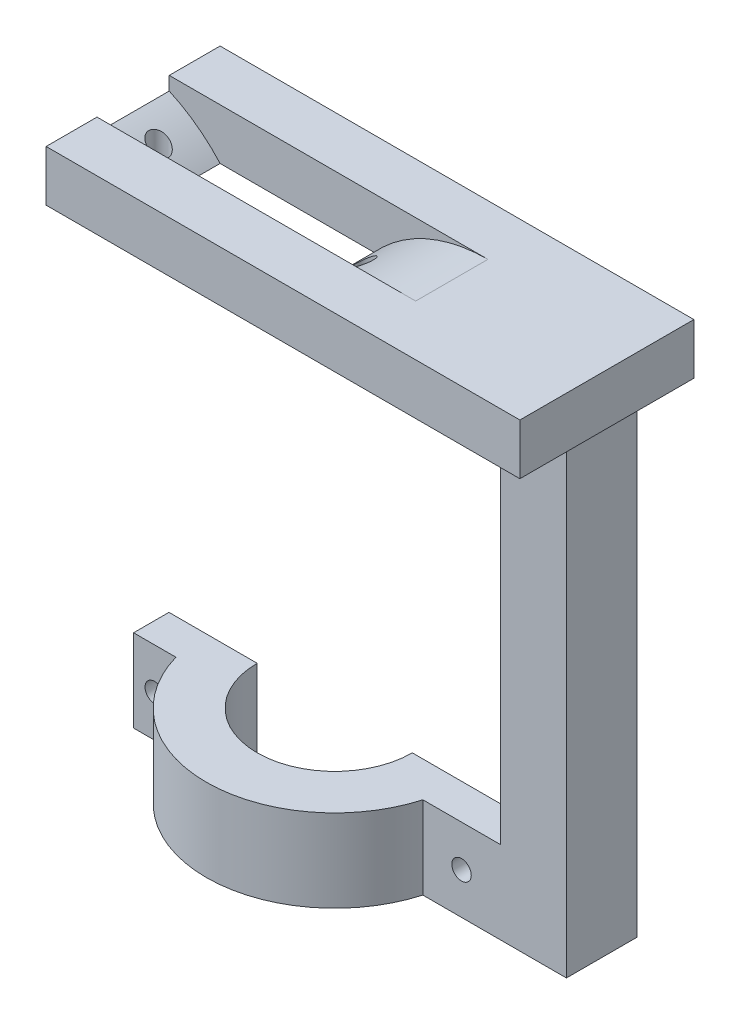
ISO-10303-21;
HEADER;
FILE_DESCRIPTION(('STEP AP214'),'2;1');
FILE_NAME('part.step','',(''),(''),'','','');
FILE_SCHEMA(('AUTOMOTIVE_DESIGN { 1 0 10303 214 1 1 1 1 }'));
ENDSEC;
DATA;
#1=APPLICATION_CONTEXT('core data for automotive mechanical design processes');
#2=APPLICATION_PROTOCOL_DEFINITION('international standard','automotive_design',2000,#1);
#3=PRODUCT_CONTEXT('',#1,'mechanical');
#4=PRODUCT('Part','Part','',(#3));
#5=PRODUCT_RELATED_PRODUCT_CATEGORY('part','',(#4));
#6=PRODUCT_DEFINITION_FORMATION('','',#4);
#7=PRODUCT_DEFINITION_CONTEXT('part definition',#1,'design');
#8=PRODUCT_DEFINITION('design','',#6,#7);
#9=PRODUCT_DEFINITION_SHAPE('','',#8);
#10=(LENGTH_UNIT() NAMED_UNIT(*) SI_UNIT(.MILLI.,.METRE.));
#11=(NAMED_UNIT(*) PLANE_ANGLE_UNIT() SI_UNIT($,.RADIAN.));
#12=(NAMED_UNIT(*) SI_UNIT($,.STERADIAN.) SOLID_ANGLE_UNIT());
#13=UNCERTAINTY_MEASURE_WITH_UNIT(LENGTH_MEASURE(1.E-05),#10,'distance_accuracy_value','');
#14=(GEOMETRIC_REPRESENTATION_CONTEXT(3) GLOBAL_UNCERTAINTY_ASSIGNED_CONTEXT((#13)) GLOBAL_UNIT_ASSIGNED_CONTEXT((#10,
#11,#12)) REPRESENTATION_CONTEXT('',''));
#15=CARTESIAN_POINT('',(0.,0.,0.));
#16=DIRECTION('',(0.,0.,1.));
#17=DIRECTION('',(1.,0.,0.));
#18=AXIS2_PLACEMENT_3D('',#15,#16,#17);
#19=CARTESIAN_POINT('',(25.14,-74.82,6.955));
#20=DIRECTION('',(1.,0.,0.));
#21=DIRECTION('',(0.,0.,-1.));
#22=AXIS2_PLACEMENT_3D('',#19,#20,#21);
#23=PLANE('',#22);
#24=DIRECTION('',(0.,1.,0.));
#25=VECTOR('',#24,1.);
#26=CARTESIAN_POINT('',(25.14,-74.82,6.955));
#27=LINE('',#26,#25);
#28=CARTESIAN_POINT('',(25.14,-58.59,6.955));
#29=VERTEX_POINT('',#28);
#30=CARTESIAN_POINT('',(25.14,15.7457363650206,6.955));
#31=VERTEX_POINT('',#30);
#32=EDGE_CURVE('E370',#29,#31,#27,.T.);
#33=ORIENTED_EDGE('',*,*,#32,.T.);
#34=DIRECTION('',(0.,0.,1.));
#35=VECTOR('',#34,1.);
#36=CARTESIAN_POINT('',(25.14,15.7457363650206,6.955));
#37=LINE('',#36,#35);
#38=CARTESIAN_POINT('',(25.14,15.7457363650206,-6.955));
#39=VERTEX_POINT('',#38);
#40=EDGE_CURVE('E295',#39,#31,#37,.T.);
#41=ORIENTED_EDGE('',*,*,#40,.F.);
#42=DIRECTION('',(0.,1.,0.));
#43=VECTOR('',#42,1.);
#44=CARTESIAN_POINT('',(25.14,-74.82,-6.955));
#45=LINE('',#44,#43);
#46=CARTESIAN_POINT('',(25.14,-74.82,-6.955));
#47=VERTEX_POINT('',#46);
#48=EDGE_CURVE('E365',#47,#39,#45,.T.);
#49=ORIENTED_EDGE('',*,*,#48,.F.);
#50=DIRECTION('',(0.,0.,-1.));
#51=VECTOR('',#50,1.);
#52=CARTESIAN_POINT('',(25.14,-74.82,0.));
#53=LINE('',#52,#51);
#54=CARTESIAN_POINT('',(25.14,-74.82,0.));
#55=VERTEX_POINT('',#54);
#56=EDGE_CURVE('E302',#55,#47,#53,.T.);
#57=ORIENTED_EDGE('',*,*,#56,.F.);
#58=DIRECTION('',(0.,1.,0.));
#59=VECTOR('',#58,1.);
#60=CARTESIAN_POINT('',(25.14,-74.82,0.));
#61=LINE('',#60,#59);
#62=CARTESIAN_POINT('',(25.14,-58.59,0.));
#63=VERTEX_POINT('',#62);
#64=EDGE_CURVE('E311',#55,#63,#61,.T.);
#65=ORIENTED_EDGE('',*,*,#64,.T.);
#66=DIRECTION('',(0.,0.,-1.));
#67=VECTOR('',#66,1.);
#68=CARTESIAN_POINT('',(25.14,-58.59,-6.955));
#69=LINE('',#68,#67);
#70=EDGE_CURVE('E352',#29,#63,#69,.T.);
#71=ORIENTED_EDGE('',*,*,#70,.F.);
#72=EDGE_LOOP('',(#33,#41,#49,#57,#65,#71));
#73=FACE_BOUND('',#72,.T.);
#74=ADVANCED_FACE('F80',(#73),#23,.F.);
#75=CARTESIAN_POINT('',(38.14,5.74573636502059,-6.955));
#76=DIRECTION('',(0.,0.,1.));
#77=DIRECTION('',(0.,-1.,0.));
#78=AXIS2_PLACEMENT_3D('',#75,#76,#77);
#79=PLANE('',#78);
#80=ORIENTED_EDGE('',*,*,#48,.T.);
#81=DIRECTION('',(-1.,0.,0.));
#82=VECTOR('',#81,1.);
#83=CARTESIAN_POINT('',(38.14,15.7457363650206,-6.955));
#84=LINE('',#83,#82);
#85=CARTESIAN_POINT('',(38.14,15.7457363650206,-6.955));
#86=VERTEX_POINT('',#85);
#87=EDGE_CURVE('E292',#86,#39,#84,.T.);
#88=ORIENTED_EDGE('',*,*,#87,.F.);
#89=DIRECTION('',(0.,1.,0.));
#90=VECTOR('',#89,1.);
#91=CARTESIAN_POINT('',(38.14,5.74573636502059,-6.955));
#92=LINE('',#91,#90);
#93=CARTESIAN_POINT('',(38.14,-74.82,-6.955));
#94=VERTEX_POINT('',#93);
#95=EDGE_CURVE('E366',#94,#86,#92,.T.);
#96=ORIENTED_EDGE('',*,*,#95,.F.);
#97=DIRECTION('',(1.,0.,0.));
#98=VECTOR('',#97,1.);
#99=CARTESIAN_POINT('',(38.14,-74.82,-6.955));
#100=LINE('',#99,#98);
#101=EDGE_CURVE('E363',#47,#94,#100,.T.);
#102=ORIENTED_EDGE('',*,*,#101,.F.);
#103=EDGE_LOOP('',(#80,#88,#96,#102));
#104=FACE_BOUND('',#103,.T.);
#105=ADVANCED_FACE('F477',(#104),#79,.F.);
#106=CARTESIAN_POINT('',(38.14,5.74573636502059,6.955));
#107=DIRECTION('',(0.,0.,-1.));
#108=DIRECTION('',(-1.,0.,0.));
#109=AXIS2_PLACEMENT_3D('',#106,#107,#108);
#110=PLANE('',#109);
#111=DIRECTION('',(0.,-1.,0.));
#112=VECTOR('',#111,1.);
#113=CARTESIAN_POINT('',(38.14,5.74573636502059,6.955));
#114=LINE('',#113,#112);
#115=CARTESIAN_POINT('',(38.14,15.7457363650206,6.955));
#116=VERTEX_POINT('',#115);
#117=CARTESIAN_POINT('',(38.14,-74.82,6.955));
#118=VERTEX_POINT('',#117);
#119=EDGE_CURVE('E369',#116,#118,#114,.T.);
#120=ORIENTED_EDGE('',*,*,#119,.F.);
#121=DIRECTION('',(1.,0.,0.));
#122=VECTOR('',#121,1.);
#123=CARTESIAN_POINT('',(38.14,15.7457363650206,6.955));
#124=LINE('',#123,#122);
#125=EDGE_CURVE('E298',#31,#116,#124,.T.);
#126=ORIENTED_EDGE('',*,*,#125,.F.);
#127=ORIENTED_EDGE('',*,*,#32,.F.);
#128=DIRECTION('',(1.,0.,0.));
#129=VECTOR('',#128,1.);
#130=CARTESIAN_POINT('',(9.92000000000001,-58.59,6.955));
#131=LINE('',#130,#129);
#132=CARTESIAN_POINT('',(9.92324607463947,-58.59,6.955));
#133=VERTEX_POINT('',#132);
#134=EDGE_CURVE('E355',#133,#29,#131,.T.);
#135=ORIENTED_EDGE('',*,*,#134,.F.);
#136=DIRECTION('',(0.,1.,0.));
#137=VECTOR('',#136,1.);
#138=CARTESIAN_POINT('',(9.92324607463947,-74.82,6.955));
#139=LINE('',#138,#137);
#140=CARTESIAN_POINT('',(9.92324607463947,-74.82,6.955));
#141=VERTEX_POINT('',#140);
#142=EDGE_CURVE('E347',#133,#141,#139,.F.);
#143=ORIENTED_EDGE('',*,*,#142,.T.);
#144=DIRECTION('',(-1.,0.,0.));
#145=VECTOR('',#144,1.);
#146=CARTESIAN_POINT('',(38.14,-74.82,6.955));
#147=LINE('',#146,#145);
#148=EDGE_CURVE('E360',#118,#141,#147,.T.);
#149=ORIENTED_EDGE('',*,*,#148,.F.);
#150=EDGE_LOOP('',(#120,#126,#127,#135,#143,#149));
#151=FACE_BOUND('',#150,.T.);
#152=CARTESIAN_POINT('',(17.5248952643869,-66.705,6.955));
#153=DIRECTION('',(0.,0.,-1.));
#154=DIRECTION('',(-1.,0.,0.));
#155=AXIS2_PLACEMENT_3D('',#152,#153,#154);
#156=CIRCLE('',#155,1.91);
#157=CARTESIAN_POINT('',(15.6148952643869,-66.705,6.955));
#158=VERTEX_POINT('',#157);
#159=EDGE_CURVE('E351',#158,#158,#156,.T.);
#160=ORIENTED_EDGE('',*,*,#159,.T.);
#161=EDGE_LOOP('',(#160));
#162=FACE_BOUND('',#161,.T.);
#163=ADVANCED_FACE('F481',(#151,#162),#110,.F.);
#164=CARTESIAN_POINT('',(38.14,0.,0.));
#165=DIRECTION('',(1.,0.,0.));
#166=DIRECTION('',(0.,0.,-1.));
#167=AXIS2_PLACEMENT_3D('',#164,#165,#166);
#168=PLANE('',#167);
#169=ORIENTED_EDGE('',*,*,#95,.T.);
#170=DIRECTION('',(0.,0.,-1.));
#171=VECTOR('',#170,1.);
#172=CARTESIAN_POINT('',(38.14,15.7457363650206,6.955));
#173=LINE('',#172,#171);
#174=EDGE_CURVE('E289',#116,#86,#173,.T.);
#175=ORIENTED_EDGE('',*,*,#174,.F.);
#176=ORIENTED_EDGE('',*,*,#119,.T.);
#177=DIRECTION('',(0.,0.,1.));
#178=VECTOR('',#177,1.);
#179=CARTESIAN_POINT('',(38.14,-74.82,6.955));
#180=LINE('',#179,#178);
#181=EDGE_CURVE('E357',#94,#118,#180,.T.);
#182=ORIENTED_EDGE('',*,*,#181,.F.);
#183=EDGE_LOOP('',(#169,#175,#176,#182));
#184=FACE_BOUND('',#183,.T.);
#185=ADVANCED_FACE('F473',(#184),#168,.T.);
#186=CARTESIAN_POINT('',(0.,-74.82,0.));
#187=DIRECTION('',(0.,1.,0.));
#188=DIRECTION('',(0.,0.,1.));
#189=AXIS2_PLACEMENT_3D('',#186,#187,#188);
#190=PLANE('',#189);
#191=DIRECTION('',(0.,0.,-1.));
#192=VECTOR('',#191,1.);
#193=CARTESIAN_POINT('',(-46.9432460746395,-74.82,25.25));
#194=LINE('',#193,#192);
#195=CARTESIAN_POINT('',(-46.9432460746395,-74.82,6.955));
#196=VERTEX_POINT('',#195);
#197=CARTESIAN_POINT('',(-46.9432460746395,-74.82,0.));
#198=VERTEX_POINT('',#197);
#199=EDGE_CURVE('E328',#196,#198,#194,.T.);
#200=ORIENTED_EDGE('',*,*,#199,.T.);
#201=DIRECTION('',(1.,0.,0.));
#202=VECTOR('',#201,1.);
#203=CARTESIAN_POINT('',(25.14,-74.82,0.));
#204=LINE('',#203,#202);
#205=CARTESIAN_POINT('',(-29.6,-74.82,0.));
#206=VERTEX_POINT('',#205);
#207=EDGE_CURVE('E309',#198,#206,#204,.T.);
#208=ORIENTED_EDGE('',*,*,#207,.T.);
#209=CARTESIAN_POINT('',(-14.35,-74.82,0.));
#210=DIRECTION('',(0.,1.,0.));
#211=DIRECTION('',(0.,0.,1.));
#212=AXIS2_PLACEMENT_3D('',#209,#210,#211);
#213=CIRCLE('',#212,15.25);
#214=CARTESIAN_POINT('',(0.900000000000007,-74.82,0.));
#215=VERTEX_POINT('',#214);
#216=EDGE_CURVE('E339',#206,#215,#213,.T.);
#217=ORIENTED_EDGE('',*,*,#216,.T.);
#218=EDGE_CURVE('E305',#215,#55,#204,.T.);
#219=ORIENTED_EDGE('',*,*,#218,.T.);
#220=ORIENTED_EDGE('',*,*,#56,.T.);
#221=ORIENTED_EDGE('',*,*,#101,.T.);
#222=ORIENTED_EDGE('',*,*,#181,.T.);
#223=ORIENTED_EDGE('',*,*,#148,.T.);
#224=CARTESIAN_POINT('',(-14.35,-74.82,0.));
#225=DIRECTION('',(0.,1.,0.));
#226=DIRECTION('',(1.,0.,0.));
#227=AXIS2_PLACEMENT_3D('',#224,#225,#226);
#228=CIRCLE('',#227,25.25);
#229=CARTESIAN_POINT('',(-38.6232460746395,-74.82,6.955));
#230=VERTEX_POINT('',#229);
#231=EDGE_CURVE('E345',#230,#141,#228,.T.);
#232=ORIENTED_EDGE('',*,*,#231,.F.);
#233=DIRECTION('',(1.,0.,0.));
#234=VECTOR('',#233,1.);
#235=CARTESIAN_POINT('',(-50.,-74.82,6.955));
#236=LINE('',#235,#234);
#237=EDGE_CURVE('E335',#196,#230,#236,.T.);
#238=ORIENTED_EDGE('',*,*,#237,.F.);
#239=EDGE_LOOP('',(#200,#208,#217,#219,#220,#221,#222,#223,#232,#238));
#240=FACE_BOUND('',#239,.T.);
#241=ADVANCED_FACE('F469',(#240),#190,.F.);
#242=CARTESIAN_POINT('',(9.92000000000001,-58.59,-6.955));
#243=DIRECTION('',(0.,-1.,0.));
#244=DIRECTION('',(0.,0.,-1.));
#245=AXIS2_PLACEMENT_3D('',#242,#243,#244);
#246=PLANE('',#245);
#247=ORIENTED_EDGE('',*,*,#70,.T.);
#248=DIRECTION('',(1.,0.,0.));
#249=VECTOR('',#248,1.);
#250=CARTESIAN_POINT('',(25.14,-58.59,0.));
#251=LINE('',#250,#249);
#252=CARTESIAN_POINT('',(0.900000000000007,-58.59,0.));
#253=VERTEX_POINT('',#252);
#254=EDGE_CURVE('E301',#253,#63,#251,.T.);
#255=ORIENTED_EDGE('',*,*,#254,.F.);
#256=CARTESIAN_POINT('',(-14.35,-58.59,0.));
#257=DIRECTION('',(0.,1.,0.));
#258=DIRECTION('',(0.,0.,1.));
#259=AXIS2_PLACEMENT_3D('',#256,#257,#258);
#260=CIRCLE('',#259,15.25);
#261=CARTESIAN_POINT('',(-29.6,-58.59,0.));
#262=VERTEX_POINT('',#261);
#263=EDGE_CURVE('E337',#262,#253,#260,.T.);
#264=ORIENTED_EDGE('',*,*,#263,.F.);
#265=CARTESIAN_POINT('',(-46.9432460746395,-58.59,0.));
#266=VERTEX_POINT('',#265);
#267=EDGE_CURVE('E306',#266,#262,#251,.T.);
#268=ORIENTED_EDGE('',*,*,#267,.F.);
#269=DIRECTION('',(0.,0.,-1.));
#270=VECTOR('',#269,1.);
#271=CARTESIAN_POINT('',(-46.9432460746395,-58.59,25.25));
#272=LINE('',#271,#270);
#273=CARTESIAN_POINT('',(-46.9432460746395,-58.59,6.955));
#274=VERTEX_POINT('',#273);
#275=EDGE_CURVE('E332',#274,#266,#272,.T.);
#276=ORIENTED_EDGE('',*,*,#275,.F.);
#277=DIRECTION('',(1.,0.,0.));
#278=VECTOR('',#277,1.);
#279=CARTESIAN_POINT('',(-50.,-58.59,6.955));
#280=LINE('',#279,#278);
#281=CARTESIAN_POINT('',(-38.6232460746395,-58.59,6.955));
#282=VERTEX_POINT('',#281);
#283=EDGE_CURVE('E331',#274,#282,#280,.T.);
#284=ORIENTED_EDGE('',*,*,#283,.T.);
#285=CARTESIAN_POINT('',(-14.35,-58.59,0.));
#286=DIRECTION('',(0.,1.,0.));
#287=DIRECTION('',(1.,0.,0.));
#288=AXIS2_PLACEMENT_3D('',#285,#286,#287);
#289=CIRCLE('',#288,25.25);
#290=EDGE_CURVE('E342',#282,#133,#289,.T.);
#291=ORIENTED_EDGE('',*,*,#290,.T.);
#292=ORIENTED_EDGE('',*,*,#134,.T.);
#293=EDGE_LOOP('',(#247,#255,#264,#268,#276,#284,#291,#292));
#294=FACE_BOUND('',#293,.T.);
#295=ADVANCED_FACE('F465',(#294),#246,.F.);
#296=CARTESIAN_POINT('',(17.5248952643869,-66.705,8.26499999999999));
#297=DIRECTION('',(0.,0.,-1.));
#298=DIRECTION('',(0.,1.,0.));
#299=AXIS2_PLACEMENT_3D('',#296,#297,#298);
#300=CYLINDRICAL_SURFACE('',#299,1.91);
#301=CARTESIAN_POINT('',(17.5248952643869,-66.705,0.));
#302=DIRECTION('',(0.,0.,1.));
#303=DIRECTION('',(1.,0.,0.));
#304=AXIS2_PLACEMENT_3D('',#301,#302,#303);
#305=CIRCLE('',#304,1.91);
#306=CARTESIAN_POINT('',(19.4348952643869,-66.705,0.));
#307=VERTEX_POINT('',#306);
#308=EDGE_CURVE('E324',#307,#307,#305,.F.);
#309=ORIENTED_EDGE('',*,*,#308,.T.);
#310=EDGE_LOOP('',(#309));
#311=FACE_BOUND('',#310,.T.);
#312=ORIENTED_EDGE('',*,*,#159,.F.);
#313=EDGE_LOOP('',(#312));
#314=FACE_BOUND('',#313,.T.);
#315=ADVANCED_FACE('F461',(#311,#314),#300,.F.);
#316=CARTESIAN_POINT('',(-14.35,-74.82,0.));
#317=DIRECTION('',(0.,1.,0.));
#318=DIRECTION('',(0.,0.,1.));
#319=AXIS2_PLACEMENT_3D('',#316,#317,#318);
#320=CYLINDRICAL_SURFACE('',#319,25.25);
#321=DIRECTION('',(0.,1.,0.));
#322=VECTOR('',#321,1.);
#323=CARTESIAN_POINT('',(-38.6232460746395,-74.82,6.955));
#324=LINE('',#323,#322);
#325=EDGE_CURVE('E372',#230,#282,#324,.T.);
#326=ORIENTED_EDGE('',*,*,#325,.F.);
#327=ORIENTED_EDGE('',*,*,#231,.T.);
#328=ORIENTED_EDGE('',*,*,#142,.F.);
#329=ORIENTED_EDGE('',*,*,#290,.F.);
#330=EDGE_LOOP('',(#326,#327,#328,#329));
#331=FACE_BOUND('',#330,.T.);
#332=ADVANCED_FACE('F457',(#331),#320,.T.);
#333=CARTESIAN_POINT('',(-14.35,-74.82,0.));
#334=DIRECTION('',(0.,1.,0.));
#335=DIRECTION('',(0.,0.,1.));
#336=AXIS2_PLACEMENT_3D('',#333,#334,#335);
#337=CYLINDRICAL_SURFACE('',#336,15.25);
#338=ORIENTED_EDGE('',*,*,#263,.T.);
#339=DIRECTION('',(0.,1.,0.));
#340=VECTOR('',#339,1.);
#341=CARTESIAN_POINT('',(0.900000000000007,-74.82,0.));
#342=LINE('',#341,#340);
#343=EDGE_CURVE('E321',#253,#215,#342,.F.);
#344=ORIENTED_EDGE('',*,*,#343,.T.);
#345=ORIENTED_EDGE('',*,*,#216,.F.);
#346=DIRECTION('',(0.,1.,0.));
#347=VECTOR('',#346,1.);
#348=CARTESIAN_POINT('',(-29.6,-74.82,0.));
#349=LINE('',#348,#347);
#350=EDGE_CURVE('E318',#206,#262,#349,.T.);
#351=ORIENTED_EDGE('',*,*,#350,.T.);
#352=EDGE_LOOP('',(#338,#344,#345,#351));
#353=FACE_BOUND('',#352,.T.);
#354=ADVANCED_FACE('F453',(#353),#337,.F.);
#355=CARTESIAN_POINT('',(-50.,-58.59,6.955));
#356=DIRECTION('',(0.,0.,1.));
#357=DIRECTION('',(1.,0.,0.));
#358=AXIS2_PLACEMENT_3D('',#355,#356,#357);
#359=PLANE('',#358);
#360=CARTESIAN_POINT('',(-42.7865081517211,-66.705,6.955));
#361=DIRECTION('',(0.,0.,1.));
#362=DIRECTION('',(1.,0.,0.));
#363=AXIS2_PLACEMENT_3D('',#360,#361,#362);
#364=CIRCLE('',#363,1.91);
#365=CARTESIAN_POINT('',(-40.8765081517211,-66.705,6.955));
#366=VERTEX_POINT('',#365);
#367=EDGE_CURVE('E327',#366,#366,#364,.T.);
#368=ORIENTED_EDGE('',*,*,#367,.F.);
#369=EDGE_LOOP('',(#368));
#370=FACE_BOUND('',#369,.T.);
#371=DIRECTION('',(0.,1.,0.));
#372=VECTOR('',#371,1.);
#373=CARTESIAN_POINT('',(-46.9432460746395,-58.59,6.955));
#374=LINE('',#373,#372);
#375=EDGE_CURVE('E377',#196,#274,#374,.T.);
#376=ORIENTED_EDGE('',*,*,#375,.F.);
#377=ORIENTED_EDGE('',*,*,#237,.T.);
#378=ORIENTED_EDGE('',*,*,#325,.T.);
#379=ORIENTED_EDGE('',*,*,#283,.F.);
#380=EDGE_LOOP('',(#376,#377,#378,#379));
#381=FACE_BOUND('',#380,.T.);
#382=ADVANCED_FACE('F449',(#370,#381),#359,.T.);
#383=CARTESIAN_POINT('',(-46.9432460746395,-74.82,25.25));
#384=DIRECTION('',(1.,0.,0.));
#385=DIRECTION('',(0.,0.,-1.));
#386=AXIS2_PLACEMENT_3D('',#383,#384,#385);
#387=PLANE('',#386);
#388=ORIENTED_EDGE('',*,*,#275,.T.);
#389=DIRECTION('',(0.,-1.,0.));
#390=VECTOR('',#389,1.);
#391=CARTESIAN_POINT('',(-46.9432460746395,-74.82,0.));
#392=LINE('',#391,#390);
#393=EDGE_CURVE('E315',#266,#198,#392,.T.);
#394=ORIENTED_EDGE('',*,*,#393,.T.);
#395=ORIENTED_EDGE('',*,*,#199,.F.);
#396=ORIENTED_EDGE('',*,*,#375,.T.);
#397=EDGE_LOOP('',(#388,#394,#395,#396));
#398=FACE_BOUND('',#397,.T.);
#399=ADVANCED_FACE('F445',(#398),#387,.F.);
#400=CARTESIAN_POINT('',(-42.7865081517211,-66.705,25.25));
#401=DIRECTION('',(0.,0.,-1.));
#402=DIRECTION('',(-1.,0.,0.));
#403=AXIS2_PLACEMENT_3D('',#400,#401,#402);
#404=CYLINDRICAL_SURFACE('',#403,1.91);
#405=CARTESIAN_POINT('',(-42.7865081517211,-66.705,0.));
#406=DIRECTION('',(0.,0.,1.));
#407=DIRECTION('',(1.,0.,0.));
#408=AXIS2_PLACEMENT_3D('',#405,#406,#407);
#409=CIRCLE('',#408,1.91);
#410=CARTESIAN_POINT('',(-40.8765081517211,-66.705,0.));
#411=VERTEX_POINT('',#410);
#412=EDGE_CURVE('E314',#411,#411,#409,.F.);
#413=ORIENTED_EDGE('',*,*,#412,.T.);
#414=EDGE_LOOP('',(#413));
#415=FACE_BOUND('',#414,.T.);
#416=ORIENTED_EDGE('',*,*,#367,.T.);
#417=EDGE_LOOP('',(#416));
#418=FACE_BOUND('',#417,.T.);
#419=ADVANCED_FACE('F442',(#415,#418),#404,.F.);
#420=CARTESIAN_POINT('',(25.14,-74.82,0.));
#421=DIRECTION('',(0.,0.,1.));
#422=DIRECTION('',(1.,0.,0.));
#423=AXIS2_PLACEMENT_3D('',#420,#421,#422);
#424=PLANE('',#423);
#425=ORIENTED_EDGE('',*,*,#412,.F.);
#426=EDGE_LOOP('',(#425));
#427=FACE_BOUND('',#426,.T.);
#428=ORIENTED_EDGE('',*,*,#207,.F.);
#429=ORIENTED_EDGE('',*,*,#393,.F.);
#430=ORIENTED_EDGE('',*,*,#267,.T.);
#431=ORIENTED_EDGE('',*,*,#350,.F.);
#432=EDGE_LOOP('',(#428,#429,#430,#431));
#433=FACE_BOUND('',#432,.T.);
#434=ADVANCED_FACE('F440',(#427,#433),#424,.F.);
#435=ORIENTED_EDGE('',*,*,#254,.T.);
#436=ORIENTED_EDGE('',*,*,#64,.F.);
#437=ORIENTED_EDGE('',*,*,#218,.F.);
#438=ORIENTED_EDGE('',*,*,#343,.F.);
#439=EDGE_LOOP('',(#435,#436,#437,#438));
#440=FACE_BOUND('',#439,.T.);
#441=ORIENTED_EDGE('',*,*,#308,.F.);
#442=EDGE_LOOP('',(#441));
#443=FACE_BOUND('',#442,.T.);
#444=ADVANCED_FACE('F426',(#440,#443),#424,.F.);
#445=CARTESIAN_POINT('',(0.,15.7457363650206,0.));
#446=DIRECTION('',(0.,-1.,0.));
#447=DIRECTION('',(0.,0.,-1.));
#448=AXIS2_PLACEMENT_3D('',#445,#446,#447);
#449=PLANE('',#448);
#450=CARTESIAN_POINT('',(-48.9900000000017,15.7457363650206,0.));
#451=DIRECTION('',(0.,1.,0.));
#452=DIRECTION('',(0.,0.,1.));
#453=AXIS2_PLACEMENT_3D('',#450,#451,#452);
#454=CIRCLE('',#453,1.91000000000001);
#455=CARTESIAN_POINT('',(-48.9900000000017,15.7457363650206,1.91000000000001));
#456=VERTEX_POINT('',#455);
#457=EDGE_CURVE('E402',#456,#456,#454,.T.);
#458=ORIENTED_EDGE('',*,*,#457,.T.);
#459=EDGE_LOOP('',(#458));
#460=FACE_BOUND('',#459,.T.);
#461=CARTESIAN_POINT('',(-8.71000000000389,15.7457363650206,0.));
#462=DIRECTION('',(0.,1.,0.));
#463=DIRECTION('',(0.,0.,1.));
#464=AXIS2_PLACEMENT_3D('',#461,#462,#463);
#465=CIRCLE('',#464,1.91);
#466=CARTESIAN_POINT('',(-8.71000000000389,15.7457363650206,1.91));
#467=VERTEX_POINT('',#466);
#468=EDGE_CURVE('E401',#467,#467,#465,.T.);
#469=ORIENTED_EDGE('',*,*,#468,.T.);
#470=EDGE_LOOP('',(#469));
#471=FACE_BOUND('',#470,.T.);
#472=DIRECTION('',(0.,0.,-1.));
#473=VECTOR('',#472,1.);
#474=CARTESIAN_POINT('',(-43.99,15.7457363650206,0.));
#475=LINE('',#474,#473);
#476=CARTESIAN_POINT('',(-43.99,15.7457363650206,7.1));
#477=VERTEX_POINT('',#476);
#478=CARTESIAN_POINT('',(-43.99,15.7457363650206,-7.1));
#479=VERTEX_POINT('',#478);
#480=EDGE_CURVE('E229',#477,#479,#475,.T.);
#481=ORIENTED_EDGE('',*,*,#480,.F.);
#482=DIRECTION('',(-1.,0.,0.));
#483=VECTOR('',#482,1.);
#484=CARTESIAN_POINT('',(0.,15.7457363650206,7.1));
#485=LINE('',#484,#483);
#486=CARTESIAN_POINT('',(-13.71,15.7457363650206,7.1));
#487=VERTEX_POINT('',#486);
#488=EDGE_CURVE('E237',#487,#477,#485,.T.);
#489=ORIENTED_EDGE('',*,*,#488,.F.);
#490=DIRECTION('',(0.,0.,1.));
#491=VECTOR('',#490,1.);
#492=CARTESIAN_POINT('',(-13.71,15.7457363650206,0.));
#493=LINE('',#492,#491);
#494=CARTESIAN_POINT('',(-13.71,15.7457363650206,-7.1));
#495=VERTEX_POINT('',#494);
#496=EDGE_CURVE('E243',#495,#487,#493,.T.);
#497=ORIENTED_EDGE('',*,*,#496,.F.);
#498=DIRECTION('',(1.,0.,0.));
#499=VECTOR('',#498,1.);
#500=CARTESIAN_POINT('',(0.,15.7457363650206,-7.1));
#501=LINE('',#500,#499);
#502=EDGE_CURVE('E250',#479,#495,#501,.T.);
#503=ORIENTED_EDGE('',*,*,#502,.F.);
#504=EDGE_LOOP('',(#481,#489,#497,#503));
#505=FACE_BOUND('',#504,.T.);
#506=DIRECTION('',(0.,0.,-1.));
#507=VECTOR('',#506,1.);
#508=CARTESIAN_POINT('',(39.14,15.7457363650206,17.1));
#509=LINE('',#508,#507);
#510=CARTESIAN_POINT('',(39.14,15.7457363650206,17.1));
#511=VERTEX_POINT('',#510);
#512=CARTESIAN_POINT('',(39.14,15.7457363650206,-17.1));
#513=VERTEX_POINT('',#512);
#514=EDGE_CURVE('E268',#511,#513,#509,.T.);
#515=ORIENTED_EDGE('',*,*,#514,.F.);
#516=DIRECTION('',(1.,0.,0.));
#517=VECTOR('',#516,1.);
#518=CARTESIAN_POINT('',(24.14,15.7457363650206,17.1));
#519=LINE('',#518,#517);
#520=CARTESIAN_POINT('',(-53.99,15.7457363650206,17.1));
#521=VERTEX_POINT('',#520);
#522=EDGE_CURVE('E273',#521,#511,#519,.T.);
#523=ORIENTED_EDGE('',*,*,#522,.F.);
#524=DIRECTION('',(0.,0.,1.));
#525=VECTOR('',#524,1.);
#526=CARTESIAN_POINT('',(-53.99,15.7457363650206,-17.1));
#527=LINE('',#526,#525);
#528=CARTESIAN_POINT('',(-53.99,15.7457363650206,-17.1));
#529=VERTEX_POINT('',#528);
#530=EDGE_CURVE('E254',#529,#521,#527,.T.);
#531=ORIENTED_EDGE('',*,*,#530,.F.);
#532=DIRECTION('',(-1.,0.,0.));
#533=VECTOR('',#532,1.);
#534=CARTESIAN_POINT('',(24.14,15.7457363650206,-17.1));
#535=LINE('',#534,#533);
#536=EDGE_CURVE('E281',#513,#529,#535,.T.);
#537=ORIENTED_EDGE('',*,*,#536,.F.);
#538=EDGE_LOOP('',(#515,#523,#531,#537));
#539=FACE_BOUND('',#538,.T.);
#540=ORIENTED_EDGE('',*,*,#40,.T.);
#541=ORIENTED_EDGE('',*,*,#125,.T.);
#542=ORIENTED_EDGE('',*,*,#174,.T.);
#543=ORIENTED_EDGE('',*,*,#87,.T.);
#544=EDGE_LOOP('',(#540,#541,#542,#543));
#545=FACE_BOUND('',#544,.T.);
#546=ADVANCED_FACE('F247',(#460,#471,#505,#539,#545),#449,.T.);
#547=CARTESIAN_POINT('',(39.14,25.7457363650206,17.1));
#548=DIRECTION('',(-1.,0.,0.));
#549=DIRECTION('',(0.,0.,1.));
#550=AXIS2_PLACEMENT_3D('',#547,#548,#549);
#551=PLANE('',#550);
#552=ORIENTED_EDGE('',*,*,#514,.T.);
#553=DIRECTION('',(0.,-1.,0.));
#554=VECTOR('',#553,1.);
#555=CARTESIAN_POINT('',(39.14,25.7457363650206,-17.1));
#556=LINE('',#555,#554);
#557=CARTESIAN_POINT('',(39.14,25.7457363650206,-17.1));
#558=VERTEX_POINT('',#557);
#559=EDGE_CURVE('E286',#558,#513,#556,.T.);
#560=ORIENTED_EDGE('',*,*,#559,.F.);
#561=DIRECTION('',(0.,0.,-1.));
#562=VECTOR('',#561,1.);
#563=CARTESIAN_POINT('',(39.14,25.7457363650206,17.1));
#564=LINE('',#563,#562);
#565=CARTESIAN_POINT('',(39.14,25.7457363650206,17.1));
#566=VERTEX_POINT('',#565);
#567=EDGE_CURVE('E269',#566,#558,#564,.T.);
#568=ORIENTED_EDGE('',*,*,#567,.F.);
#569=DIRECTION('',(0.,-1.,0.));
#570=VECTOR('',#569,1.);
#571=CARTESIAN_POINT('',(39.14,25.7457363650206,17.1));
#572=LINE('',#571,#570);
#573=EDGE_CURVE('E278',#566,#511,#572,.T.);
#574=ORIENTED_EDGE('',*,*,#573,.T.);
#575=EDGE_LOOP('',(#552,#560,#568,#574));
#576=FACE_BOUND('',#575,.T.);
#577=ADVANCED_FACE('F425',(#576),#551,.F.);
#578=CARTESIAN_POINT('',(24.14,25.7457363650206,-17.1));
#579=DIRECTION('',(0.,0.,1.));
#580=DIRECTION('',(1.,0.,0.));
#581=AXIS2_PLACEMENT_3D('',#578,#579,#580);
#582=PLANE('',#581);
#583=ORIENTED_EDGE('',*,*,#536,.T.);
#584=DIRECTION('',(0.,-1.,0.));
#585=VECTOR('',#584,1.);
#586=CARTESIAN_POINT('',(-53.99,25.7457363650206,-17.1));
#587=LINE('',#586,#585);
#588=CARTESIAN_POINT('',(-53.99,25.7457363650206,-17.1));
#589=VERTEX_POINT('',#588);
#590=EDGE_CURVE('E251',#589,#529,#587,.T.);
#591=ORIENTED_EDGE('',*,*,#590,.F.);
#592=DIRECTION('',(-1.,0.,0.));
#593=VECTOR('',#592,1.);
#594=CARTESIAN_POINT('',(24.14,25.7457363650206,-17.1));
#595=LINE('',#594,#593);
#596=EDGE_CURVE('E272',#558,#589,#595,.T.);
#597=ORIENTED_EDGE('',*,*,#596,.F.);
#598=ORIENTED_EDGE('',*,*,#559,.T.);
#599=EDGE_LOOP('',(#583,#591,#597,#598));
#600=FACE_BOUND('',#599,.T.);
#601=ADVANCED_FACE('F430',(#600),#582,.F.);
#602=CARTESIAN_POINT('',(24.14,25.7457363650206,17.1));
#603=DIRECTION('',(0.,0.,-1.));
#604=DIRECTION('',(-1.,0.,0.));
#605=AXIS2_PLACEMENT_3D('',#602,#603,#604);
#606=PLANE('',#605);
#607=ORIENTED_EDGE('',*,*,#522,.T.);
#608=ORIENTED_EDGE('',*,*,#573,.F.);
#609=DIRECTION('',(1.,0.,0.));
#610=VECTOR('',#609,1.);
#611=CARTESIAN_POINT('',(24.14,25.7457363650206,17.1));
#612=LINE('',#611,#610);
#613=CARTESIAN_POINT('',(-53.99,25.7457363650206,17.1));
#614=VERTEX_POINT('',#613);
#615=EDGE_CURVE('E276',#614,#566,#612,.T.);
#616=ORIENTED_EDGE('',*,*,#615,.F.);
#617=DIRECTION('',(0.,1.,0.));
#618=VECTOR('',#617,1.);
#619=CARTESIAN_POINT('',(-53.99,25.7457363650206,17.1));
#620=LINE('',#619,#618);
#621=EDGE_CURVE('E261',#521,#614,#620,.T.);
#622=ORIENTED_EDGE('',*,*,#621,.F.);
#623=EDGE_LOOP('',(#607,#608,#616,#622));
#624=FACE_BOUND('',#623,.T.);
#625=ADVANCED_FACE('F422',(#624),#606,.F.);
#626=CARTESIAN_POINT('',(0.,25.7457363650206,0.));
#627=DIRECTION('',(0.,-1.,0.));
#628=DIRECTION('',(0.,0.,-1.));
#629=AXIS2_PLACEMENT_3D('',#626,#627,#628);
#630=PLANE('',#629);
#631=DIRECTION('',(1.,0.,0.));
#632=VECTOR('',#631,1.);
#633=CARTESIAN_POINT('',(-13.71,25.7457363650206,7.1));
#634=LINE('',#633,#632);
#635=CARTESIAN_POINT('',(-53.99,25.7457363650206,7.1));
#636=VERTEX_POINT('',#635);
#637=CARTESIAN_POINT('',(8.6506797749979,25.7457363650206,7.1));
#638=VERTEX_POINT('',#637);
#639=EDGE_CURVE('E101',#636,#638,#634,.T.);
#640=ORIENTED_EDGE('',*,*,#639,.F.);
#641=DIRECTION('',(0.,0.,-1.));
#642=VECTOR('',#641,1.);
#643=CARTESIAN_POINT('',(-53.99,25.7457363650206,-17.1));
#644=LINE('',#643,#642);
#645=EDGE_CURVE('E265',#614,#636,#644,.T.);
#646=ORIENTED_EDGE('',*,*,#645,.F.);
#647=ORIENTED_EDGE('',*,*,#615,.T.);
#648=ORIENTED_EDGE('',*,*,#567,.T.);
#649=ORIENTED_EDGE('',*,*,#596,.T.);
#650=CARTESIAN_POINT('',(-53.99,25.7457363650206,-7.1));
#651=VERTEX_POINT('',#650);
#652=EDGE_CURVE('E264',#651,#589,#644,.T.);
#653=ORIENTED_EDGE('',*,*,#652,.F.);
#654=DIRECTION('',(-1.,0.,0.));
#655=VECTOR('',#654,1.);
#656=CARTESIAN_POINT('',(-13.71,25.7457363650206,-7.1));
#657=LINE('',#656,#655);
#658=CARTESIAN_POINT('',(8.6506797749979,25.7457363650206,-7.1));
#659=VERTEX_POINT('',#658);
#660=EDGE_CURVE('E244',#659,#651,#657,.T.);
#661=ORIENTED_EDGE('',*,*,#660,.F.);
#662=DIRECTION('',(0.,0.,-1.));
#663=VECTOR('',#662,1.);
#664=CARTESIAN_POINT('',(8.6506797749979,25.7457363650206,0.));
#665=LINE('',#664,#663);
#666=EDGE_CURVE('E379',#659,#638,#665,.F.);
#667=ORIENTED_EDGE('',*,*,#666,.T.);
#668=EDGE_LOOP('',(#640,#646,#647,#648,#649,#653,#661,#667));
#669=FACE_BOUND('',#668,.T.);
#670=ADVANCED_FACE('F418',(#669),#630,.F.);
#671=CARTESIAN_POINT('',(-53.99,0.,0.));
#672=DIRECTION('',(-1.,0.,0.));
#673=DIRECTION('',(0.,0.,1.));
#674=AXIS2_PLACEMENT_3D('',#671,#672,#673);
#675=PLANE('',#674);
#676=ORIENTED_EDGE('',*,*,#645,.T.);
#677=DIRECTION('',(0.,-1.,0.));
#678=VECTOR('',#677,1.);
#679=CARTESIAN_POINT('',(-53.99,-24.5342636349794,7.1));
#680=LINE('',#679,#678);
#681=CARTESIAN_POINT('',(-53.99,23.0809443484978,7.1));
#682=VERTEX_POINT('',#681);
#683=EDGE_CURVE('E234',#636,#682,#680,.T.);
#684=ORIENTED_EDGE('',*,*,#683,.T.);
#685=DIRECTION('',(0.,0.,1.));
#686=VECTOR('',#685,1.);
#687=CARTESIAN_POINT('',(-53.99,23.0809443484978,0.));
#688=LINE('',#687,#686);
#689=CARTESIAN_POINT('',(-53.99,23.0809443484978,-7.1));
#690=VERTEX_POINT('',#689);
#691=EDGE_CURVE('E230',#682,#690,#688,.F.);
#692=ORIENTED_EDGE('',*,*,#691,.T.);
#693=DIRECTION('',(0.,1.,0.));
#694=VECTOR('',#693,1.);
#695=CARTESIAN_POINT('',(-53.99,-24.5342636349794,-7.1));
#696=LINE('',#695,#694);
#697=EDGE_CURVE('E109',#690,#651,#696,.T.);
#698=ORIENTED_EDGE('',*,*,#697,.T.);
#699=ORIENTED_EDGE('',*,*,#652,.T.);
#700=ORIENTED_EDGE('',*,*,#590,.T.);
#701=ORIENTED_EDGE('',*,*,#530,.T.);
#702=ORIENTED_EDGE('',*,*,#621,.T.);
#703=EDGE_LOOP('',(#676,#684,#692,#698,#699,#700,#701,#702));
#704=FACE_BOUND('',#703,.T.);
#705=ADVANCED_FACE('F413',(#704),#675,.T.);
#706=CARTESIAN_POINT('',(-13.71,-24.5342636349794,-7.1));
#707=DIRECTION('',(0.,0.,-1.));
#708=DIRECTION('',(-1.,0.,0.));
#709=AXIS2_PLACEMENT_3D('',#706,#707,#708);
#710=PLANE('',#709);
#711=ORIENTED_EDGE('',*,*,#502,.T.);
#712=CARTESIAN_POINT('',(8.6506797749979,-4.25426363497941,-7.1));
#713=DIRECTION('',(0.,0.,-1.));
#714=DIRECTION('',(-1.,0.,0.));
#715=AXIS2_PLACEMENT_3D('',#712,#713,#714);
#716=CIRCLE('',#715,30.);
#717=EDGE_CURVE('E93',#495,#659,#716,.T.);
#718=ORIENTED_EDGE('',*,*,#717,.T.);
#719=ORIENTED_EDGE('',*,*,#660,.T.);
#720=ORIENTED_EDGE('',*,*,#697,.F.);
#721=CARTESIAN_POINT('',(-66.3506797749979,-4.25426363497941,-7.1));
#722=DIRECTION('',(0.,0.,-1.));
#723=DIRECTION('',(-1.,0.,0.));
#724=AXIS2_PLACEMENT_3D('',#721,#722,#723);
#725=CIRCLE('',#724,30.);
#726=EDGE_CURVE('E233',#690,#479,#725,.T.);
#727=ORIENTED_EDGE('',*,*,#726,.T.);
#728=EDGE_LOOP('',(#711,#718,#719,#720,#727));
#729=FACE_BOUND('',#728,.T.);
#730=ADVANCED_FACE('F410',(#729),#710,.F.);
#731=CARTESIAN_POINT('',(-13.71,-24.5342636349794,7.1));
#732=DIRECTION('',(0.,0.,1.));
#733=DIRECTION('',(1.,0.,0.));
#734=AXIS2_PLACEMENT_3D('',#731,#732,#733);
#735=PLANE('',#734);
#736=ORIENTED_EDGE('',*,*,#488,.T.);
#737=CARTESIAN_POINT('',(-66.3506797749979,-4.25426363497941,7.1));
#738=DIRECTION('',(0.,0.,1.));
#739=DIRECTION('',(1.,0.,0.));
#740=AXIS2_PLACEMENT_3D('',#737,#738,#739);
#741=CIRCLE('',#740,30.);
#742=EDGE_CURVE('E223',#477,#682,#741,.T.);
#743=ORIENTED_EDGE('',*,*,#742,.T.);
#744=ORIENTED_EDGE('',*,*,#683,.F.);
#745=ORIENTED_EDGE('',*,*,#639,.T.);
#746=CARTESIAN_POINT('',(8.6506797749979,-4.25426363497941,7.1));
#747=DIRECTION('',(0.,0.,1.));
#748=DIRECTION('',(1.,0.,0.));
#749=AXIS2_PLACEMENT_3D('',#746,#747,#748);
#750=CIRCLE('',#749,30.);
#751=EDGE_CURVE('E14',#638,#487,#750,.T.);
#752=ORIENTED_EDGE('',*,*,#751,.T.);
#753=EDGE_LOOP('',(#736,#743,#744,#745,#752));
#754=FACE_BOUND('',#753,.T.);
#755=ADVANCED_FACE('F238',(#754),#735,.F.);
#756=CARTESIAN_POINT('',(-8.71000000000389,15.7457363650206,0.));
#757=DIRECTION('',(0.,1.,0.));
#758=DIRECTION('',(0.,0.,1.));
#759=AXIS2_PLACEMENT_3D('',#756,#757,#758);
#760=CYLINDRICAL_SURFACE('',#759,1.91);
#761=ORIENTED_EDGE('',*,*,#468,.F.);
#762=EDGE_LOOP('',(#761));
#763=FACE_BOUND('',#762,.T.);
#764=CARTESIAN_POINT('',(-7.13605087420372,21.2561094593044,-1.08202779511192));
#765=CARTESIAN_POINT('',(-7.20024756078058,21.2163816597174,-1.17539865500023));
#766=CARTESIAN_POINT('',(-7.2718557488001,21.1717303577961,-1.2616977477907));
#767=CARTESIAN_POINT('',(-7.42620332658249,21.0744190806141,-1.41849586967726));
#768=CARTESIAN_POINT('',(-7.50896706345933,21.0217415542769,-1.48895941413734));
#769=CARTESIAN_POINT('',(-7.68162404214039,20.9105196626638,-1.61299747828413));
#770=CARTESIAN_POINT('',(-7.77146526515827,20.8520173973397,-1.66668302741348));
#771=CARTESIAN_POINT('',(-7.95594422947425,20.7303768194905,-1.75786619496678));
#772=CARTESIAN_POINT('',(-8.05058057518328,20.6672398534912,-1.7953684935225));
#773=CARTESIAN_POINT('',(-8.25622343594195,20.5282730605066,-1.85886222570244));
#774=CARTESIAN_POINT('',(-8.36762796401027,20.4519231133359,-1.88242478913048));
#775=CARTESIAN_POINT('',(-8.59101389135446,20.2965522027215,-1.90961274782874));
#776=CARTESIAN_POINT('',(-8.70299561180926,20.217529575229,-1.91322548327176));
#777=CARTESIAN_POINT('',(-8.94033739689373,20.0475917527178,-1.90027056349236));
#778=CARTESIAN_POINT('',(-9.06544109942406,19.9565233596904,-1.8808858606164));
#779=CARTESIAN_POINT('',(-9.31033499242755,19.7754094892768,-1.81761276729898));
#780=CARTESIAN_POINT('',(-9.43011815593394,19.6853654750453,-1.77369295404796));
#781=CARTESIAN_POINT('',(-9.66564779255005,19.5056805085867,-1.65912470256613));
#782=CARTESIAN_POINT('',(-9.78103323681541,19.4162041738026,-1.58746399386796));
#783=CARTESIAN_POINT('',(-9.99759375131572,19.2459649561557,-1.41741190077395));
#784=CARTESIAN_POINT('',(-10.098806928172,19.165178848104,-1.31909436927223));
#785=CARTESIAN_POINT('',(-10.2477267837391,19.0450036374487,-1.1366180281144));
#786=CARTESIAN_POINT('',(-10.3015197474198,19.0012323665254,-1.0602742745555));
#787=CARTESIAN_POINT('',(-10.3987116603246,18.9216853629361,-0.89739830826013));
#788=CARTESIAN_POINT('',(-10.4421178285944,18.8859040782211,-0.81087323451766));
#789=CARTESIAN_POINT('',(-10.5164818255089,18.8243475453384,-0.628124059046814));
#790=CARTESIAN_POINT('',(-10.5473146878053,18.7986728297615,-0.531813937418487));
#791=CARTESIAN_POINT('',(-10.593481471012,18.7601491226252,-0.333099958489606));
#792=CARTESIAN_POINT('',(-10.608835255148,18.7472836940618,-0.230704089845795));
#793=CARTESIAN_POINT('',(-10.6216182624441,18.7365730665827,-0.0396297794661084));
#794=CARTESIAN_POINT('',(-10.6214008476878,18.7367558098332,0.0487893569125348));
#795=CARTESIAN_POINT('',(-10.6088369463821,18.747281604433,0.224135458043341));
#796=CARTESIAN_POINT('',(-10.5964919211324,18.7576234316774,0.311062601287201));
#797=CARTESIAN_POINT('',(-10.561542746304,18.7868079433292,0.476032673720424));
#798=CARTESIAN_POINT('',(-10.5395536666424,18.8051406170084,0.554300378252504));
#799=CARTESIAN_POINT('',(-10.4866988095977,18.8490243695418,0.705597665011524));
#800=CARTESIAN_POINT('',(-10.4558316076657,18.8745766068074,0.778626404263008));
#801=CARTESIAN_POINT('',(-10.3826518512738,18.9348451018425,0.926203875323256));
#802=CARTESIAN_POINT('',(-10.3394487531819,18.9702640593003,1.00002018042535));
#803=CARTESIAN_POINT('',(-10.2453452448338,19.0468937205921,1.13925048358707));
#804=CARTESIAN_POINT('',(-10.1944380604654,19.0881095192448,1.20465699246069));
#805=CARTESIAN_POINT('',(-10.0602368431284,19.1959412070336,1.35631292313573));
#806=CARTESIAN_POINT('',(-9.97317653601057,19.2652097288101,1.43736962327939));
#807=CARTESIAN_POINT('',(-9.78900976514422,19.409878474131,1.58033868484201));
#808=CARTESIAN_POINT('',(-9.69188821160257,19.4852878704025,1.64222171839904));
#809=CARTESIAN_POINT('',(-9.48920962221897,19.6405244206779,1.74760661565483));
#810=CARTESIAN_POINT('',(-9.38356299811149,19.7203947268228,1.79087129640717));
#811=CARTESIAN_POINT('',(-9.16734620635434,19.8815220372641,1.85788799556358));
#812=CARTESIAN_POINT('',(-9.0567767400989,19.9627788430044,1.88164278436874));
#813=CARTESIAN_POINT('',(-8.8158201976577,20.1372652596178,1.91148900734185));
#814=CARTESIAN_POINT('',(-8.68497570974938,20.2304371323172,1.91434629753369));
#815=CARTESIAN_POINT('',(-8.42313571092519,20.413739567391,1.89290015029228));
#816=CARTESIAN_POINT('',(-8.29214016708829,20.5038674373118,1.8685732845006));
#817=CARTESIAN_POINT('',(-8.03608784953772,20.6771499067711,1.79208739671005));
#818=CARTESIAN_POINT('',(-7.91097738068274,20.7603774632435,1.74027931613461));
#819=CARTESIAN_POINT('',(-7.67058051647671,20.917883773141,1.60823244657127));
#820=CARTESIAN_POINT('',(-7.55527174533592,20.9921830782275,1.52806069420171));
#821=CARTESIAN_POINT('',(-7.3738159429214,21.1075861179021,1.36842135034805));
#822=CARTESIAN_POINT('',(-7.30337055500771,21.15192032846,1.29612687472239));
#823=CARTESIAN_POINT('',(-7.17321551620009,21.2331882720742,1.13876829131447));
#824=CARTESIAN_POINT('',(-7.11349983909244,21.2701261605286,1.05371140096328));
#825=CARTESIAN_POINT('',(-7.00731935439693,21.3354022048354,0.871855112970445));
#826=CARTESIAN_POINT('',(-6.9609393524676,21.3636853927648,0.77498591042985));
#827=CARTESIAN_POINT('',(-6.88467136419236,21.4100088510139,0.572656951420955));
#828=CARTESIAN_POINT('',(-6.85477331659109,21.428055370408,0.467202480976889));
#829=CARTESIAN_POINT('',(-6.81573478890933,21.4515815780531,0.263451581351671));
#830=CARTESIAN_POINT('',(-6.80466055897058,21.4582326413143,0.165657653559595));
#831=CARTESIAN_POINT('',(-6.79772558400763,21.4624001264384,-0.030659706863323));
#832=CARTESIAN_POINT('',(-6.80186052363701,21.4599191393671,-0.129182924653748));
#833=CARTESIAN_POINT('',(-6.82440025889034,21.4463598514561,-0.318002216950742));
#834=CARTESIAN_POINT('',(-6.84194841873986,21.4357976215412,-0.408440659724782));
#835=CARTESIAN_POINT('',(-6.88940862288262,21.4071161888802,-0.584692331000352));
#836=CARTESIAN_POINT('',(-6.91931241141218,21.3890020320955,-0.670508604737755));
#837=CARTESIAN_POINT('',(-6.97978875392246,21.352167327894,-0.811498610096536));
#838=CARTESIAN_POINT('',(-7.0076343062887,21.3351572317791,-0.868322198084502));
#839=CARTESIAN_POINT('',(-7.0682697730893,21.297955354089,-0.97813995253506));
#840=CARTESIAN_POINT('',(-7.10105935061465,21.2777637893099,-1.03113437957088));
#841=CARTESIAN_POINT('',(-7.13605087420372,21.2561094593044,-1.08202779511192));
#842=B_SPLINE_CURVE_WITH_KNOTS('',3,(#764,#765,#766,#767,#768,#769,#770,#771,#772,#773,#774,
#775,#776,#777,#778,#779,#780,#781,#782,#783,#784,#785,#786,#787,#788,#789,#790,#791,#792,#793,
#794,#795,#796,#797,#798,#799,#800,#801,#802,#803,#804,#805,#806,#807,#808,#809,#810,#811,#812,
#813,#814,#815,#816,#817,#818,#819,#820,#821,#822,#823,#824,#825,#826,#827,#828,#829,#830,#831,
#832,#833,#834,#835,#836,#837,#838,#839,#840,#841),.UNSPECIFIED.,.T.,.F.,(4,2,2,2,2,2,2,2,2,2,2,
2,2,2,2,2,2,2,2,2,2,2,2,2,2,2,2,2,2,2,2,2,2,2,2,2,2,2,4),(0.,0.359947445133693,
0.720693599442061,1.07899930669552,1.43720132380518,1.84688256431943,2.25682375184761,
2.72262721980721,3.18902862767068,3.67435554197893,4.15835135715347,4.46666118027825,
4.77475609500098,5.08584262198522,5.39652944317038,5.66037653626124,5.92419184135917,
6.17319168766905,6.4222315098383,6.69893777343941,6.97588877062862,7.38661514179705,
7.79796668958806,8.21441365314904,8.63080147108817,9.11048832626114,9.59058891320595,
10.064701099695,10.5377001420067,10.8671239736788,11.1963622061019,11.5276500635885,
11.8587354649189,12.1531164780251,12.4474139719071,12.7243415214086,13.0010843323841,
13.1972933292878,13.39348896163),.UNSPECIFIED.);
#843=CARTESIAN_POINT('',(-7.13605087420372,21.2561094593044,-1.08202779511192));
#844=VERTEX_POINT('',#843);
#845=EDGE_CURVE('E396',#844,#844,#842,.T.);
#846=ORIENTED_EDGE('',*,*,#845,.T.);
#847=EDGE_LOOP('',(#846));
#848=FACE_BOUND('',#847,.T.);
#849=ADVANCED_FACE('F403',(#763,#848),#760,.F.);
#850=CARTESIAN_POINT('',(-48.9900000000017,15.7457363650206,0.));
#851=DIRECTION('',(0.,1.,0.));
#852=DIRECTION('',(0.,0.,1.));
#853=AXIS2_PLACEMENT_3D('',#850,#851,#852);
#854=CYLINDRICAL_SURFACE('',#853,1.91000000000001);
#855=ORIENTED_EDGE('',*,*,#457,.F.);
#856=EDGE_LOOP('',(#855));
#857=FACE_BOUND('',#856,.T.);
#858=CARTESIAN_POINT('',(-50.5639491258013,21.2561094593075,-1.08202779511276));
#859=CARTESIAN_POINT('',(-50.6162770161457,21.2884918029622,-1.00590371979));
#860=CARTESIAN_POINT('',(-50.6637727071741,21.3176605445385,-0.924949160555848));
#861=CARTESIAN_POINT('',(-50.7470295693656,21.3685484931633,-0.754930525440327));
#862=CARTESIAN_POINT('',(-50.7827775230127,21.3902593104493,-0.665857458222142));
#863=CARTESIAN_POINT('',(-50.840833171561,21.425413619427,-0.48153137641138));
#864=CARTESIAN_POINT('',(-50.8631001443976,21.4388320648175,-0.38626059074525));
#865=CARTESIAN_POINT('',(-50.8927805882219,21.4567002404964,-0.192638968456553));
#866=CARTESIAN_POINT('',(-50.9002015949628,21.461154520966,-0.0942897202120043));
#867=CARTESIAN_POINT('',(-50.8998001289957,21.4609130451163,0.0974649567672223));
#868=CARTESIAN_POINT('',(-50.8927157469323,21.4566603350064,0.190873554154596));
#869=CARTESIAN_POINT('',(-50.865148018307,21.4400657128559,0.374940347579304));
#870=CARTESIAN_POINT('',(-50.844664736473,21.4277238398927,0.465598556901092));
#871=CARTESIAN_POINT('',(-50.7914157520251,21.395497710199,0.641413432191657));
#872=CARTESIAN_POINT('',(-50.7586953101427,21.375641243987,0.72658903210658));
#873=CARTESIAN_POINT('',(-50.6824248460171,21.3290859525216,0.889903240553474));
#874=CARTESIAN_POINT('',(-50.6388725667564,21.3023857012012,0.96804037786111));
#875=CARTESIAN_POINT('',(-50.5390682471391,21.2407675773988,1.12136548655911));
#876=CARTESIAN_POINT('',(-50.4821162609625,21.2053887283053,1.19591045193058));
#877=CARTESIAN_POINT('',(-50.3598042033346,21.1287446436466,1.33426963374883));
#878=CARTESIAN_POINT('',(-50.2944405493678,21.0874768991905,1.39807925115596));
#879=CARTESIAN_POINT('',(-50.1483564709155,20.9943630066838,1.52205221011146));
#880=CARTESIAN_POINT('',(-50.0667450838194,20.9418391698483,1.58065377592164));
#881=CARTESIAN_POINT('',(-49.8978972822598,20.8319102393835,1.68333070543143));
#882=CARTESIAN_POINT('',(-49.8106577616804,20.774502444675,1.72739796434964));
#883=CARTESIAN_POINT('',(-49.6184827613627,20.6465178792166,1.8070931358258));
#884=CARTESIAN_POINT('',(-49.5129468416454,20.5753024818836,1.84024797270155));
#885=CARTESIAN_POINT('',(-49.2999920194334,20.429551704602,1.88783637035979));
#886=CARTESIAN_POINT('',(-49.192572197414,20.3550146743917,1.90226051560164));
#887=CARTESIAN_POINT('',(-48.9621737894553,20.1928731180995,1.91377374052183));
#888=CARTESIAN_POINT('',(-48.8392540543563,20.1049720436505,1.90796984529956));
#889=CARTESIAN_POINT('',(-48.5968214750235,19.9288506814219,1.87310754162921));
#890=CARTESIAN_POINT('',(-48.4773126280356,19.8406301454835,1.8440229229008));
#891=CARTESIAN_POINT('',(-48.2358347105707,19.6596823849415,1.75980463070088));
#892=CARTESIAN_POINT('',(-48.1143642346676,19.5671195448134,1.70286572780099));
#893=CARTESIAN_POINT('',(-47.882891567357,19.3881158712843,1.56227218327229));
#894=CARTESIAN_POINT('',(-47.7728719598934,19.3016658069039,1.47865892309564));
#895=CARTESIAN_POINT('',(-47.6008137065849,19.1647607075932,1.31443665743056));
#896=CARTESIAN_POINT('',(-47.5344149319547,19.1114037190292,1.24078775881945));
#897=CARTESIAN_POINT('',(-47.4120136055655,19.0123023301506,1.0808160572851));
#898=CARTESIAN_POINT('',(-47.3559949340179,18.9665461378115,0.994513285016076));
#899=CARTESIAN_POINT('',(-47.2659279026866,18.8925512582952,0.826491392125075));
#900=CARTESIAN_POINT('',(-47.2297465298669,18.8626459157875,0.746656054105137));
#901=CARTESIAN_POINT('',(-47.1681267669536,18.81153938993,0.58028339438205));
#902=CARTESIAN_POINT('',(-47.1426825746157,18.7903335056696,0.493749722376633));
#903=CARTESIAN_POINT('',(-47.1040288112722,18.7580609060763,0.315544002551386));
#904=CARTESIAN_POINT('',(-47.0908942454819,18.747056354022,0.22384401715184));
#905=CARTESIAN_POINT('',(-47.0781496103563,18.7363792308263,0.0388597647968387));
#906=CARTESIAN_POINT('',(-47.0785338269714,18.736701871965,-0.054423816148489));
#907=CARTESIAN_POINT('',(-47.0920380793344,18.748013928929,-0.229730114388431));
#908=CARTESIAN_POINT('',(-47.1038548284755,18.7579117795951,-0.311930774488552));
#909=CARTESIAN_POINT('',(-47.1375974764184,18.7860911167197,-0.472709991743247));
#910=CARTESIAN_POINT('',(-47.1595242052859,18.8043732915607,-0.55128825090289));
#911=CARTESIAN_POINT('',(-47.2132567487479,18.8489891687986,-0.705843015759986));
#912=CARTESIAN_POINT('',(-47.245381876159,18.8755826077218,-0.781631808171013));
#913=CARTESIAN_POINT('',(-47.3177794859656,18.9351932149526,-0.926470571401331));
#914=CARTESIAN_POINT('',(-47.3580575031858,18.9682147465704,-0.995515916774754));
#915=CARTESIAN_POINT('',(-47.4645967098703,19.0550134724398,-1.15500865385267));
#916=CARTESIAN_POINT('',(-47.5345009989812,19.1115375000927,-1.24154048674033));
#917=CARTESIAN_POINT('',(-47.6849335046765,19.231886042045,-1.3988530921521));
#918=CARTESIAN_POINT('',(-47.7654784471872,19.2957220284808,-1.46960858538663));
#919=CARTESIAN_POINT('',(-47.9357259759516,19.4290919213231,-1.59625064367858));
#920=CARTESIAN_POINT('',(-48.0255440685557,19.4986948315193,-1.65190758775567));
#921=CARTESIAN_POINT('',(-48.2111475638594,19.6407368648604,-1.74710343534352));
#922=CARTESIAN_POINT('',(-48.3069318583932,19.7131754603801,-1.78664532184397));
#923=CARTESIAN_POINT('',(-48.5232005905236,19.8746141510179,-1.85624697271744));
#924=CARTESIAN_POINT('',(-48.6446666799217,19.9639143395838,-1.88260330513226));
#925=CARTESIAN_POINT('',(-48.890912605822,20.1420407849193,-1.91145655848121));
#926=CARTESIAN_POINT('',(-49.0156958489984,20.2308664323354,-1.9139279194249));
#927=CARTESIAN_POINT('',(-49.2731420393531,20.4111753561806,-1.89357521351497));
#928=CARTESIAN_POINT('',(-49.4058121007522,20.5024800247777,-1.86916741638786));
#929=CARTESIAN_POINT('',(-49.6666752594788,20.6790214373683,-1.79127947727316));
#930=CARTESIAN_POINT('',(-49.7948724034142,20.7642637424638,-1.73782637838019));
#931=CARTESIAN_POINT('',(-50.0090547025482,20.9044977764791,-1.61880793869215));
#932=CARTESIAN_POINT('',(-50.0973931803261,20.961617757861,-1.5599323292753));
#933=CARTESIAN_POINT('',(-50.2652374623055,21.0690141764093,-1.42594637013151));
#934=CARTESIAN_POINT('',(-50.3447710735568,21.1193122783607,-1.35088947347262));
#935=CARTESIAN_POINT('',(-50.44408846101,21.1815634820668,-1.23905380626329));
#936=CARTESIAN_POINT('',(-50.4692251642091,21.1972632937498,-1.20894456974232));
#937=CARTESIAN_POINT('',(-50.5178584750838,21.2275453123125,-1.14686696489381));
#938=CARTESIAN_POINT('',(-50.5413542720877,21.2421269671229,-1.11489769173346));
#939=CARTESIAN_POINT('',(-50.5639491258013,21.2561094593075,-1.08202779511276));
#940=B_SPLINE_CURVE_WITH_KNOTS('',3,(#858,#859,#860,#861,#862,#863,#864,#865,#866,#867,#868,
#869,#870,#871,#872,#873,#874,#875,#876,#877,#878,#879,#880,#881,#882,#883,#884,#885,#886,#887,
#888,#889,#890,#891,#892,#893,#894,#895,#896,#897,#898,#899,#900,#901,#902,#903,#904,#905,#906,
#907,#908,#909,#910,#911,#912,#913,#914,#915,#916,#917,#918,#919,#920,#921,#922,#923,#924,#925,
#926,#927,#928,#929,#930,#931,#932,#933,#934,#935,#936,#937,#938,#939),.UNSPECIFIED.,.T.,.F.,(4,
2,2,2,2,2,2,2,2,2,2,2,2,2,2,2,2,2,2,2,2,2,2,2,2,2,2,2,2,2,2,2,2,2,2,2,2,2,2,2,4),(0.,
0.293515330699657,0.587359777217695,0.882087469081859,1.17666552034734,1.45662699889781,
1.73658712501088,2.01552186102955,2.29451476712174,2.59409327191032,2.89379979158482,
3.23260683486749,3.5716024893188,3.96475707861927,4.35810922239053,4.80988567303759,
5.26217146654461,5.748694983308,6.23446736904186,6.57108806677546,6.90718154589017,
7.18389908571627,7.46046689859617,7.73870914705349,8.01683379091881,8.2665846061295,
8.51635593043066,8.7748813774561,9.03358292415933,9.40588458273058,9.77877858058508,
10.1570606992637,10.5352727639114,10.9924502673021,11.4501169553009,11.9362646931191,
12.4219605689287,12.782264690747,13.1413963435412,13.2680722695378,13.3948103420304),.UNSPECIFIED.);
#941=CARTESIAN_POINT('',(-50.5639491258013,21.2561094593075,-1.08202779511276));
#942=VERTEX_POINT('',#941);
#943=EDGE_CURVE('E85',#942,#942,#940,.T.);
#944=ORIENTED_EDGE('',*,*,#943,.T.);
#945=EDGE_LOOP('',(#944));
#946=FACE_BOUND('',#945,.T.);
#947=ADVANCED_FACE('F407',(#857,#946),#854,.F.);
#948=CARTESIAN_POINT('',(-66.3506797749979,-4.25426363497941,7.1));
#949=DIRECTION('',(0.,0.,1.));
#950=DIRECTION('',(1.,0.,0.));
#951=AXIS2_PLACEMENT_3D('',#948,#949,#950);
#952=CYLINDRICAL_SURFACE('',#951,30.);
#953=ORIENTED_EDGE('',*,*,#726,.F.);
#954=ORIENTED_EDGE('',*,*,#691,.F.);
#955=ORIENTED_EDGE('',*,*,#742,.F.);
#956=ORIENTED_EDGE('',*,*,#480,.T.);
#957=EDGE_LOOP('',(#953,#954,#955,#956));
#958=FACE_BOUND('',#957,.T.);
#959=ORIENTED_EDGE('',*,*,#943,.F.);
#960=EDGE_LOOP('',(#959));
#961=FACE_BOUND('',#960,.T.);
#962=ADVANCED_FACE('F226',(#958,#961),#952,.T.);
#963=CARTESIAN_POINT('',(8.6506797749979,-4.25426363497941,7.1));
#964=DIRECTION('',(0.,0.,-1.));
#965=DIRECTION('',(-1.,0.,0.));
#966=AXIS2_PLACEMENT_3D('',#963,#964,#965);
#967=CYLINDRICAL_SURFACE('',#966,30.);
#968=ORIENTED_EDGE('',*,*,#751,.F.);
#969=ORIENTED_EDGE('',*,*,#666,.F.);
#970=ORIENTED_EDGE('',*,*,#717,.F.);
#971=ORIENTED_EDGE('',*,*,#496,.T.);
#972=EDGE_LOOP('',(#968,#969,#970,#971));
#973=FACE_BOUND('',#972,.T.);
#974=ORIENTED_EDGE('',*,*,#845,.F.);
#975=EDGE_LOOP('',(#974));
#976=FACE_BOUND('',#975,.T.);
#977=ADVANCED_FACE('F82',(#973,#976),#967,.T.);
#978=CLOSED_SHELL('',(#74,#105,#163,#185,#241,#295,#315,#332,#354,#382,#399,#419,#434,#444,#546,
#577,#601,#625,#670,#705,#730,#755,#849,#947,#962,#977));
#979=MANIFOLD_SOLID_BREP('B2',#978);
#980=ADVANCED_BREP_SHAPE_REPRESENTATION('',(#18,#979),#14);
#981=SHAPE_DEFINITION_REPRESENTATION(#9,#980);
ENDSEC;
END-ISO-10303-21;
